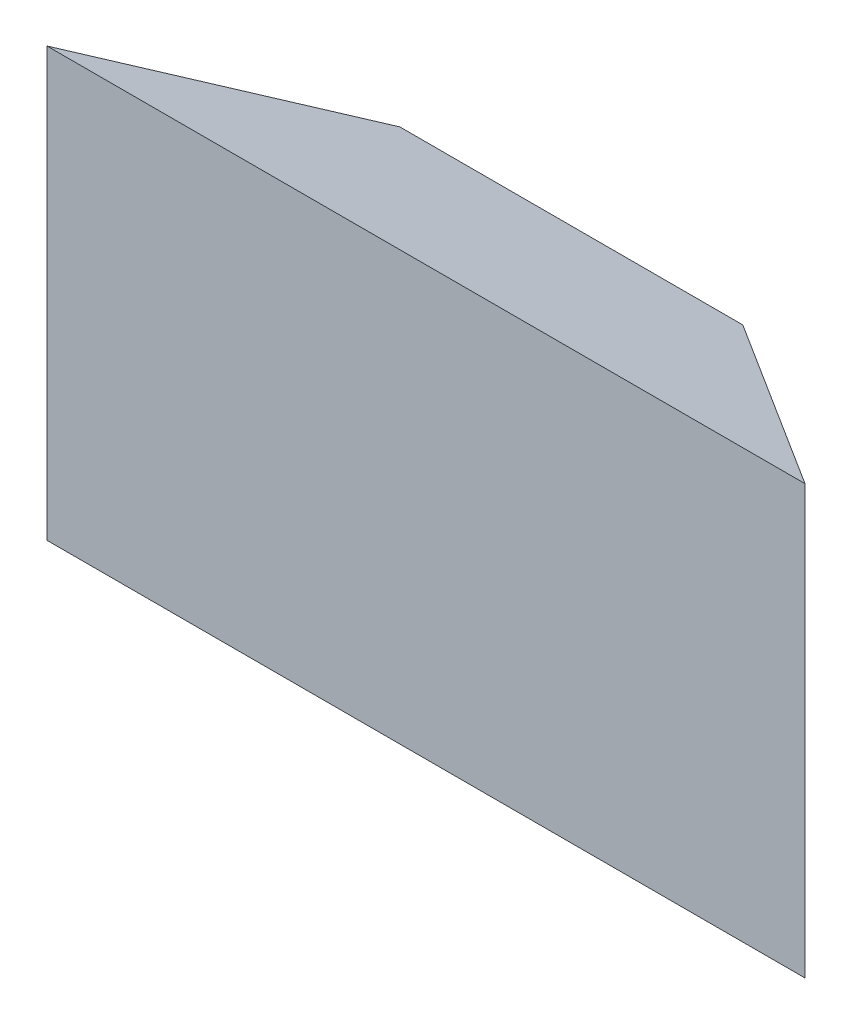
ISO-10303-21;
HEADER;
FILE_DESCRIPTION(('STEP AP214'),'2;1');
FILE_NAME('part.step','',(''),(''),'','','');
FILE_SCHEMA(('AUTOMOTIVE_DESIGN { 1 0 10303 214 1 1 1 1 }'));
ENDSEC;
DATA;
#1=APPLICATION_CONTEXT('core data for automotive mechanical design processes');
#2=APPLICATION_PROTOCOL_DEFINITION('international standard','automotive_design',2000,#1);
#3=PRODUCT_CONTEXT('',#1,'mechanical');
#4=PRODUCT('Part','Part','',(#3));
#5=PRODUCT_RELATED_PRODUCT_CATEGORY('part','',(#4));
#6=PRODUCT_DEFINITION_FORMATION('','',#4);
#7=PRODUCT_DEFINITION_CONTEXT('part definition',#1,'design');
#8=PRODUCT_DEFINITION('design','',#6,#7);
#9=PRODUCT_DEFINITION_SHAPE('','',#8);
#10=(LENGTH_UNIT() NAMED_UNIT(*) SI_UNIT(.MILLI.,.METRE.));
#11=(NAMED_UNIT(*) PLANE_ANGLE_UNIT() SI_UNIT($,.RADIAN.));
#12=(NAMED_UNIT(*) SI_UNIT($,.STERADIAN.) SOLID_ANGLE_UNIT());
#13=UNCERTAINTY_MEASURE_WITH_UNIT(LENGTH_MEASURE(1.E-05),#10,'distance_accuracy_value','');
#14=(GEOMETRIC_REPRESENTATION_CONTEXT(3) GLOBAL_UNCERTAINTY_ASSIGNED_CONTEXT((#13)) GLOBAL_UNIT_ASSIGNED_CONTEXT((#10,
#11,#12)) REPRESENTATION_CONTEXT('',''));
#15=CARTESIAN_POINT('',(0.,0.,0.));
#16=DIRECTION('',(0.,0.,1.));
#17=DIRECTION('',(1.,0.,0.));
#18=AXIS2_PLACEMENT_3D('',#15,#16,#17);
#19=CARTESIAN_POINT('',(-118.,-62.5,0.));
#20=DIRECTION('',(-0.573576436351044,0.,-0.819152044288993));
#21=DIRECTION('',(-0.819152044288993,0.,0.573576436351044));
#22=AXIS2_PLACEMENT_3D('',#19,#20,#21);
#23=PLANE('',#22);
#24=DIRECTION('',(0.,1.,0.));
#25=VECTOR('',#24,1.);
#26=CARTESIAN_POINT('',(-260.814800674212,-62.5,100.));
#27=LINE('',#26,#25);
#28=CARTESIAN_POINT('',(-260.814800674212,89.2949192431115,100.));
#29=VERTEX_POINT('',#28);
#30=CARTESIAN_POINT('',(-260.814800674212,-205.314800674212,100.));
#31=VERTEX_POINT('',#30);
#32=EDGE_CURVE('E56',#29,#31,#27,.F.);
#33=ORIENTED_EDGE('',*,*,#32,.F.);
#34=DIRECTION('',(-0.809645768037902,0.151905774945495,0.566920070059726));
#35=VECTOR('',#34,1.);
#36=CARTESIAN_POINT('',(-102.626266521858,59.6155794422761,-10.7648040718221));
#37=LINE('',#36,#35);
#38=CARTESIAN_POINT('',(-118.,62.5,0.));
#39=VERTEX_POINT('',#38);
#40=EDGE_CURVE('E79',#29,#39,#37,.F.);
#41=ORIENTED_EDGE('',*,*,#40,.T.);
#42=DIRECTION('',(0.,-1.,0.));
#43=VECTOR('',#42,1.);
#44=CARTESIAN_POINT('',(-118.,-62.5,0.));
#45=LINE('',#44,#43);
#46=CARTESIAN_POINT('',(-118.,-62.5,0.));
#47=VERTEX_POINT('',#46);
#48=EDGE_CURVE('E91',#39,#47,#45,.T.);
#49=ORIENTED_EDGE('',*,*,#48,.T.);
#50=DIRECTION('',(0.633687274224643,0.633687274224643,-0.443712606279656));
#51=VECTOR('',#50,1.);
#52=CARTESIAN_POINT('',(-23.2319434826352,32.2680565173647,-66.3573075549423));
#53=LINE('',#52,#51);
#54=EDGE_CURVE('E11',#31,#47,#53,.T.);
#55=ORIENTED_EDGE('',*,*,#54,.F.);
#56=EDGE_LOOP('',(#33,#41,#49,#55));
#57=FACE_BOUND('',#56,.T.);
#58=ADVANCED_FACE('F34',(#57),#23,.T.);
#59=CARTESIAN_POINT('',(118.,-62.5,0.));
#60=DIRECTION('',(0.,-0.573576436351044,-0.819152044288993));
#61=DIRECTION('',(0.,0.819152044288993,-0.573576436351044));
#62=AXIS2_PLACEMENT_3D('',#59,#60,#61);
#63=PLANE('',#62);
#64=DIRECTION('',(1.,0.,0.));
#65=VECTOR('',#64,1.);
#66=CARTESIAN_POINT('',(118.,-62.5,0.));
#67=LINE('',#66,#65);
#68=CARTESIAN_POINT('',(118.,-62.5,0.));
#69=VERTEX_POINT('',#68);
#70=EDGE_CURVE('E94',#47,#69,#67,.T.);
#71=ORIENTED_EDGE('',*,*,#70,.T.);
#72=DIRECTION('',(-0.633687274224643,0.633687274224643,-0.443712606279656));
#73=VECTOR('',#72,1.);
#74=CARTESIAN_POINT('',(118.,-62.5,0.));
#75=LINE('',#74,#73);
#76=CARTESIAN_POINT('',(260.814800674212,-205.314800674212,100.));
#77=VERTEX_POINT('',#76);
#78=EDGE_CURVE('E43',#77,#69,#75,.T.);
#79=ORIENTED_EDGE('',*,*,#78,.F.);
#80=DIRECTION('',(-1.,0.,0.));
#81=VECTOR('',#80,1.);
#82=CARTESIAN_POINT('',(118.,-205.314800674212,100.));
#83=LINE('',#82,#81);
#84=EDGE_CURVE('E51',#31,#77,#83,.F.);
#85=ORIENTED_EDGE('',*,*,#84,.F.);
#86=ORIENTED_EDGE('',*,*,#54,.T.);
#87=EDGE_LOOP('',(#71,#79,#85,#86));
#88=FACE_BOUND('',#87,.T.);
#89=ADVANCED_FACE('F36',(#88),#63,.T.);
#90=CARTESIAN_POINT('',(118.,-62.5,0.));
#91=DIRECTION('',(0.573576436351044,0.,-0.819152044288993));
#92=DIRECTION('',(-0.819152044288993,0.,-0.573576436351044));
#93=AXIS2_PLACEMENT_3D('',#90,#91,#92);
#94=PLANE('',#93);
#95=DIRECTION('',(0.,1.,0.));
#96=VECTOR('',#95,1.);
#97=CARTESIAN_POINT('',(118.,-62.5,0.));
#98=LINE('',#97,#96);
#99=CARTESIAN_POINT('',(118.,62.5,0.));
#100=VERTEX_POINT('',#99);
#101=EDGE_CURVE('E86',#69,#100,#98,.T.);
#102=ORIENTED_EDGE('',*,*,#101,.T.);
#103=DIRECTION('',(-0.809645768037902,-0.151905774945495,-0.566920070059726));
#104=VECTOR('',#103,1.);
#105=CARTESIAN_POINT('',(102.626266521858,59.6155794422761,-10.7648040718221));
#106=LINE('',#105,#104);
#107=CARTESIAN_POINT('',(260.814800674212,89.2949192431115,100.));
#108=VERTEX_POINT('',#107);
#109=EDGE_CURVE('E81',#100,#108,#106,.F.);
#110=ORIENTED_EDGE('',*,*,#109,.T.);
#111=DIRECTION('',(0.,-1.,0.));
#112=VECTOR('',#111,1.);
#113=CARTESIAN_POINT('',(260.814800674212,-62.5,100.));
#114=LINE('',#113,#112);
#115=EDGE_CURVE('E38',#77,#108,#114,.F.);
#116=ORIENTED_EDGE('',*,*,#115,.F.);
#117=ORIENTED_EDGE('',*,*,#78,.T.);
#118=EDGE_LOOP('',(#102,#110,#116,#117));
#119=FACE_BOUND('',#118,.T.);
#120=ADVANCED_FACE('F106',(#119),#94,.T.);
#121=CARTESIAN_POINT('',(0.,0.,100.));
#122=DIRECTION('',(0.,0.,1.));
#123=DIRECTION('',(1.,0.,0.));
#124=AXIS2_PLACEMENT_3D('',#121,#122,#123);
#125=PLANE('',#124);
#126=DIRECTION('',(1.,0.,0.));
#127=VECTOR('',#126,1.);
#128=CARTESIAN_POINT('',(0.,89.2949192431115,100.));
#129=LINE('',#128,#127);
#130=EDGE_CURVE('E104',#29,#108,#129,.T.);
#131=ORIENTED_EDGE('',*,*,#130,.F.);
#132=ORIENTED_EDGE('',*,*,#32,.T.);
#133=ORIENTED_EDGE('',*,*,#84,.T.);
#134=ORIENTED_EDGE('',*,*,#115,.T.);
#135=EDGE_LOOP('',(#131,#132,#133,#134));
#136=FACE_BOUND('',#135,.T.);
#137=ADVANCED_FACE('F103',(#136),#125,.T.);
#138=CARTESIAN_POINT('',(0.,0.,0.));
#139=DIRECTION('',(0.,0.,1.));
#140=DIRECTION('',(1.,0.,0.));
#141=AXIS2_PLACEMENT_3D('',#138,#139,#140);
#142=PLANE('',#141);
#143=ORIENTED_EDGE('',*,*,#48,.F.);
#144=DIRECTION('',(-1.,0.,0.));
#145=VECTOR('',#144,1.);
#146=CARTESIAN_POINT('',(118.,62.5,0.));
#147=LINE('',#146,#145);
#148=EDGE_CURVE('E76',#100,#39,#147,.T.);
#149=ORIENTED_EDGE('',*,*,#148,.F.);
#150=ORIENTED_EDGE('',*,*,#101,.F.);
#151=ORIENTED_EDGE('',*,*,#70,.F.);
#152=EDGE_LOOP('',(#143,#149,#150,#151));
#153=FACE_BOUND('',#152,.T.);
#154=ADVANCED_FACE('F93',(#153),#142,.F.);
#155=CARTESIAN_POINT('',(-260.814800674212,62.5,0.));
#156=DIRECTION('',(0.,-0.96592582628907,0.258819045102514));
#157=DIRECTION('',(0.,-0.258819045102514,-0.96592582628907));
#158=AXIS2_PLACEMENT_3D('',#155,#156,#157);
#159=PLANE('',#158);
#160=ORIENTED_EDGE('',*,*,#130,.T.);
#161=ORIENTED_EDGE('',*,*,#109,.F.);
#162=ORIENTED_EDGE('',*,*,#148,.T.);
#163=ORIENTED_EDGE('',*,*,#40,.F.);
#164=EDGE_LOOP('',(#160,#161,#162,#163));
#165=FACE_BOUND('',#164,.T.);
#166=ADVANCED_FACE('F78',(#165),#159,.F.);
#167=CLOSED_SHELL('',(#58,#89,#120,#137,#154,#166));
#168=MANIFOLD_SOLID_BREP('B2',#167);
#169=ADVANCED_BREP_SHAPE_REPRESENTATION('',(#18,#168),#14);
#170=SHAPE_DEFINITION_REPRESENTATION(#9,#169);
ENDSEC;
END-ISO-10303-21;
